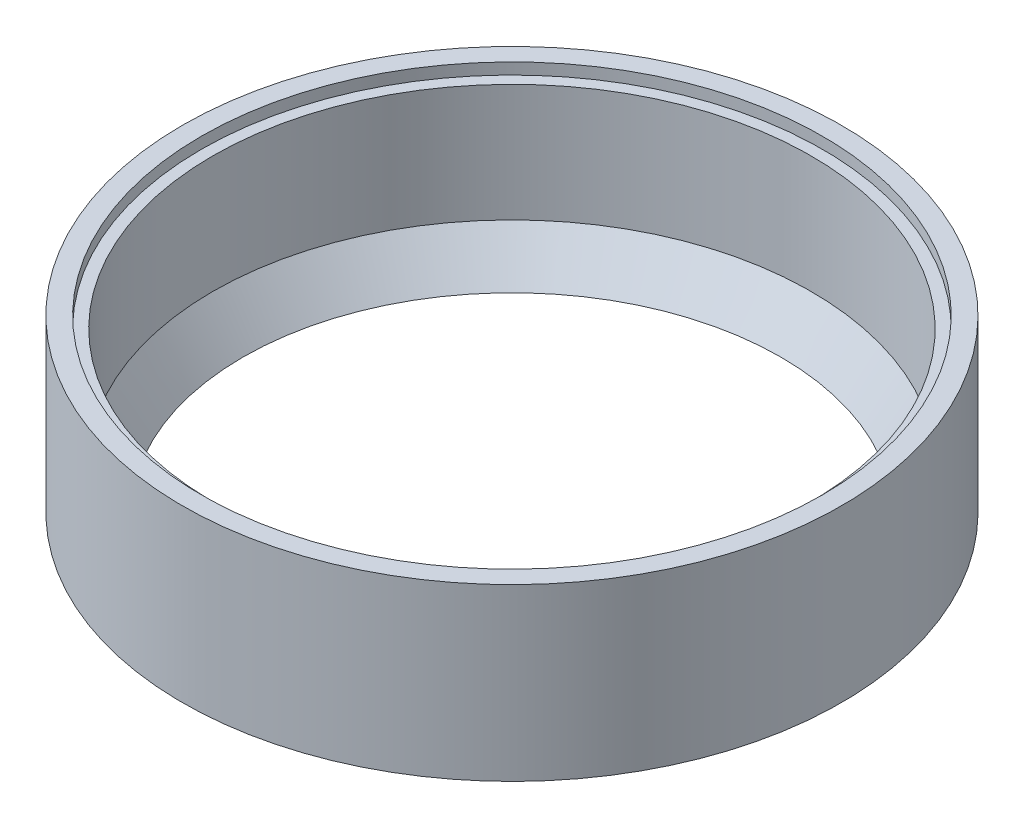
ISO-10303-21;
HEADER;
FILE_DESCRIPTION(('STEP AP214'),'2;1');
FILE_NAME('part.step','',(''),(''),'','','');
FILE_SCHEMA(('AUTOMOTIVE_DESIGN { 1 0 10303 214 1 1 1 1 }'));
ENDSEC;
DATA;
#1=APPLICATION_CONTEXT('core data for automotive mechanical design processes');
#2=APPLICATION_PROTOCOL_DEFINITION('international standard','automotive_design',2000,#1);
#3=PRODUCT_CONTEXT('',#1,'mechanical');
#4=PRODUCT('Part','Part','',(#3));
#5=PRODUCT_RELATED_PRODUCT_CATEGORY('part','',(#4));
#6=PRODUCT_DEFINITION_FORMATION('','',#4);
#7=PRODUCT_DEFINITION_CONTEXT('part definition',#1,'design');
#8=PRODUCT_DEFINITION('design','',#6,#7);
#9=PRODUCT_DEFINITION_SHAPE('','',#8);
#10=(LENGTH_UNIT() NAMED_UNIT(*) SI_UNIT(.MILLI.,.METRE.));
#11=(NAMED_UNIT(*) PLANE_ANGLE_UNIT() SI_UNIT($,.RADIAN.));
#12=(NAMED_UNIT(*) SI_UNIT($,.STERADIAN.) SOLID_ANGLE_UNIT());
#13=UNCERTAINTY_MEASURE_WITH_UNIT(LENGTH_MEASURE(1.E-05),#10,'distance_accuracy_value','');
#14=(GEOMETRIC_REPRESENTATION_CONTEXT(3) GLOBAL_UNCERTAINTY_ASSIGNED_CONTEXT((#13)) GLOBAL_UNIT_ASSIGNED_CONTEXT((#10,
#11,#12)) REPRESENTATION_CONTEXT('',''));
#15=CARTESIAN_POINT('',(0.,0.,0.));
#16=DIRECTION('',(0.,0.,1.));
#17=DIRECTION('',(1.,0.,0.));
#18=AXIS2_PLACEMENT_3D('',#15,#16,#17);
#19=CARTESIAN_POINT('',(0.,13.8123062312929,0.));
#20=DIRECTION('',(0.,1.,0.));
#21=DIRECTION('',(-1.,0.,0.));
#22=AXIS2_PLACEMENT_3D('',#19,#20,#21);
#23=CONICAL_SURFACE('',#22,79.,0.628796286415434);
#24=CARTESIAN_POINT('',(0.,2.81230623129294,0.));
#25=DIRECTION('',(0.,1.,0.));
#26=DIRECTION('',(-1.,0.,0.));
#27=AXIS2_PLACEMENT_3D('',#24,#25,#26);
#28=CIRCLE('',#27,71.);
#29=CARTESIAN_POINT('',(-71.,2.81230623129293,0.));
#30=VERTEX_POINT('',#29);
#31=EDGE_CURVE('E10',#30,#30,#28,.T.);
#32=ORIENTED_EDGE('',*,*,#31,.F.);
#33=EDGE_LOOP('',(#32));
#34=FACE_BOUND('',#33,.T.);
#35=CARTESIAN_POINT('',(0.,13.8123062312929,0.));
#36=DIRECTION('',(0.,1.,0.));
#37=DIRECTION('',(-1.,0.,0.));
#38=AXIS2_PLACEMENT_3D('',#35,#36,#37);
#39=CIRCLE('',#38,79.);
#40=CARTESIAN_POINT('',(-79.,13.8123062312929,0.));
#41=VERTEX_POINT('',#40);
#42=EDGE_CURVE('E68',#41,#41,#39,.T.);
#43=ORIENTED_EDGE('',*,*,#42,.T.);
#44=EDGE_LOOP('',(#43));
#45=FACE_BOUND('',#44,.T.);
#46=ADVANCED_FACE('F31',(#34,#45),#23,.F.);
#47=CARTESIAN_POINT('',(71.,2.81230623129295,0.));
#48=DIRECTION('',(0.,1.,0.));
#49=DIRECTION('',(-1.,0.,0.));
#50=AXIS2_PLACEMENT_3D('',#47,#48,#49);
#51=PLANE('',#50);
#52=CARTESIAN_POINT('',(0.,2.81230623129294,0.));
#53=DIRECTION('',(0.,1.,0.));
#54=DIRECTION('',(-1.,0.,0.));
#55=AXIS2_PLACEMENT_3D('',#52,#53,#54);
#56=CIRCLE('',#55,75.);
#57=CARTESIAN_POINT('',(-75.,2.81230623129293,0.));
#58=VERTEX_POINT('',#57);
#59=EDGE_CURVE('E37',#58,#58,#56,.T.);
#60=ORIENTED_EDGE('',*,*,#59,.F.);
#61=EDGE_LOOP('',(#60));
#62=FACE_BOUND('',#61,.T.);
#63=ORIENTED_EDGE('',*,*,#31,.T.);
#64=EDGE_LOOP('',(#63));
#65=FACE_BOUND('',#64,.T.);
#66=ADVANCED_FACE('F123',(#62,#65),#51,.F.);
#67=CARTESIAN_POINT('',(0.,40.546875,0.));
#68=DIRECTION('',(0.,1.,0.));
#69=DIRECTION('',(-1.,0.,0.));
#70=AXIS2_PLACEMENT_3D('',#67,#68,#69);
#71=CYLINDRICAL_SURFACE('',#70,75.);
#72=CARTESIAN_POINT('',(0.,7.81230623129294,0.));
#73=DIRECTION('',(0.,1.,0.));
#74=DIRECTION('',(-1.,0.,0.));
#75=AXIS2_PLACEMENT_3D('',#72,#73,#74);
#76=CIRCLE('',#75,75.);
#77=CARTESIAN_POINT('',(-75.,7.81230623129293,0.));
#78=VERTEX_POINT('',#77);
#79=EDGE_CURVE('E41',#78,#78,#76,.T.);
#80=ORIENTED_EDGE('',*,*,#79,.F.);
#81=EDGE_LOOP('',(#80));
#82=FACE_BOUND('',#81,.T.);
#83=ORIENTED_EDGE('',*,*,#59,.T.);
#84=EDGE_LOOP('',(#83));
#85=FACE_BOUND('',#84,.T.);
#86=ADVANCED_FACE('F118',(#82,#85),#71,.T.);
#87=CARTESIAN_POINT('',(75.,7.81230623129295,0.));
#88=DIRECTION('',(0.,1.,0.));
#89=DIRECTION('',(-1.,0.,0.));
#90=AXIS2_PLACEMENT_3D('',#87,#88,#89);
#91=PLANE('',#90);
#92=CARTESIAN_POINT('',(0.,7.81230623129294,0.));
#93=DIRECTION('',(0.,1.,0.));
#94=DIRECTION('',(-1.,0.,0.));
#95=AXIS2_PLACEMENT_3D('',#92,#93,#94);
#96=CIRCLE('',#95,80.);
#97=CARTESIAN_POINT('',(-80.,7.81230623129293,0.));
#98=VERTEX_POINT('',#97);
#99=EDGE_CURVE('E45',#98,#98,#96,.T.);
#100=ORIENTED_EDGE('',*,*,#99,.F.);
#101=EDGE_LOOP('',(#100));
#102=FACE_BOUND('',#101,.T.);
#103=ORIENTED_EDGE('',*,*,#79,.T.);
#104=EDGE_LOOP('',(#103));
#105=FACE_BOUND('',#104,.T.);
#106=ADVANCED_FACE('F112',(#102,#105),#91,.F.);
#107=CARTESIAN_POINT('',(0.,40.546875,0.));
#108=DIRECTION('',(0.,1.,0.));
#109=DIRECTION('',(-1.,0.,0.));
#110=AXIS2_PLACEMENT_3D('',#107,#108,#109);
#111=CYLINDRICAL_SURFACE('',#110,80.);
#112=CARTESIAN_POINT('',(0.,2.81230623129294,0.));
#113=DIRECTION('',(0.,1.,0.));
#114=DIRECTION('',(-1.,0.,0.));
#115=AXIS2_PLACEMENT_3D('',#112,#113,#114);
#116=CIRCLE('',#115,80.);
#117=CARTESIAN_POINT('',(-80.,2.81230623129293,0.));
#118=VERTEX_POINT('',#117);
#119=EDGE_CURVE('E50',#118,#118,#116,.T.);
#120=ORIENTED_EDGE('',*,*,#119,.F.);
#121=EDGE_LOOP('',(#120));
#122=FACE_BOUND('',#121,.T.);
#123=ORIENTED_EDGE('',*,*,#99,.T.);
#124=EDGE_LOOP('',(#123));
#125=FACE_BOUND('',#124,.T.);
#126=ADVANCED_FACE('F106',(#122,#125),#111,.F.);
#127=CARTESIAN_POINT('',(80.,2.81230623129295,0.));
#128=DIRECTION('',(0.,1.,0.));
#129=DIRECTION('',(-1.,0.,0.));
#130=AXIS2_PLACEMENT_3D('',#127,#128,#129);
#131=PLANE('',#130);
#132=CARTESIAN_POINT('',(0.,2.81230623129294,0.));
#133=DIRECTION('',(0.,1.,0.));
#134=DIRECTION('',(-1.,0.,0.));
#135=AXIS2_PLACEMENT_3D('',#132,#133,#134);
#136=CIRCLE('',#135,87.);
#137=CARTESIAN_POINT('',(-87.,2.81230623129293,0.));
#138=VERTEX_POINT('',#137);
#139=EDGE_CURVE('E53',#138,#138,#136,.T.);
#140=ORIENTED_EDGE('',*,*,#139,.F.);
#141=EDGE_LOOP('',(#140));
#142=FACE_BOUND('',#141,.T.);
#143=ORIENTED_EDGE('',*,*,#119,.T.);
#144=EDGE_LOOP('',(#143));
#145=FACE_BOUND('',#144,.T.);
#146=ADVANCED_FACE('F100',(#142,#145),#131,.F.);
#147=CARTESIAN_POINT('',(0.,40.546875,0.));
#148=DIRECTION('',(0.,1.,0.));
#149=DIRECTION('',(-1.,0.,0.));
#150=AXIS2_PLACEMENT_3D('',#147,#148,#149);
#151=CYLINDRICAL_SURFACE('',#150,87.);
#152=CARTESIAN_POINT('',(0.,47.8123062312929,0.));
#153=DIRECTION('',(0.,1.,0.));
#154=DIRECTION('',(-1.,0.,0.));
#155=AXIS2_PLACEMENT_3D('',#152,#153,#154);
#156=CIRCLE('',#155,87.);
#157=CARTESIAN_POINT('',(-87.,47.8123062312929,0.));
#158=VERTEX_POINT('',#157);
#159=EDGE_CURVE('E56',#158,#158,#156,.T.);
#160=ORIENTED_EDGE('',*,*,#159,.F.);
#161=EDGE_LOOP('',(#160));
#162=FACE_BOUND('',#161,.T.);
#163=ORIENTED_EDGE('',*,*,#139,.T.);
#164=EDGE_LOOP('',(#163));
#165=FACE_BOUND('',#164,.T.);
#166=ADVANCED_FACE('F94',(#162,#165),#151,.T.);
#167=CARTESIAN_POINT('',(87.,47.812306231293,0.));
#168=DIRECTION('',(0.,-1.,0.));
#169=DIRECTION('',(1.,0.,0.));
#170=AXIS2_PLACEMENT_3D('',#167,#168,#169);
#171=PLANE('',#170);
#172=CARTESIAN_POINT('',(0.,47.8123062312929,0.));
#173=DIRECTION('',(0.,1.,0.));
#174=DIRECTION('',(-1.,0.,0.));
#175=AXIS2_PLACEMENT_3D('',#172,#173,#174);
#176=CIRCLE('',#175,82.);
#177=CARTESIAN_POINT('',(-82.,47.8123062312929,0.));
#178=VERTEX_POINT('',#177);
#179=EDGE_CURVE('E59',#178,#178,#176,.T.);
#180=ORIENTED_EDGE('',*,*,#179,.F.);
#181=EDGE_LOOP('',(#180));
#182=FACE_BOUND('',#181,.T.);
#183=ORIENTED_EDGE('',*,*,#159,.T.);
#184=EDGE_LOOP('',(#183));
#185=FACE_BOUND('',#184,.T.);
#186=ADVANCED_FACE('F88',(#182,#185),#171,.F.);
#187=CARTESIAN_POINT('',(0.,40.546875,0.));
#188=DIRECTION('',(0.,1.,0.));
#189=DIRECTION('',(-1.,0.,0.));
#190=AXIS2_PLACEMENT_3D('',#187,#188,#189);
#191=CYLINDRICAL_SURFACE('',#190,82.);
#192=CARTESIAN_POINT('',(0.,44.8123062312929,0.));
#193=DIRECTION('',(0.,1.,0.));
#194=DIRECTION('',(-1.,0.,0.));
#195=AXIS2_PLACEMENT_3D('',#192,#193,#194);
#196=CIRCLE('',#195,82.);
#197=CARTESIAN_POINT('',(-82.,44.8123062312929,0.));
#198=VERTEX_POINT('',#197);
#199=EDGE_CURVE('E62',#198,#198,#196,.T.);
#200=ORIENTED_EDGE('',*,*,#199,.F.);
#201=EDGE_LOOP('',(#200));
#202=FACE_BOUND('',#201,.T.);
#203=ORIENTED_EDGE('',*,*,#179,.T.);
#204=EDGE_LOOP('',(#203));
#205=FACE_BOUND('',#204,.T.);
#206=ADVANCED_FACE('F82',(#202,#205),#191,.F.);
#207=CARTESIAN_POINT('',(82.,44.8123062312929,0.));
#208=DIRECTION('',(0.,-1.,0.));
#209=DIRECTION('',(1.,0.,0.));
#210=AXIS2_PLACEMENT_3D('',#207,#208,#209);
#211=PLANE('',#210);
#212=CARTESIAN_POINT('',(0.,44.8123062312929,0.));
#213=DIRECTION('',(0.,1.,0.));
#214=DIRECTION('',(-1.,0.,0.));
#215=AXIS2_PLACEMENT_3D('',#212,#213,#214);
#216=CIRCLE('',#215,79.);
#217=CARTESIAN_POINT('',(-79.,44.8123062312929,0.));
#218=VERTEX_POINT('',#217);
#219=EDGE_CURVE('E65',#218,#218,#216,.T.);
#220=ORIENTED_EDGE('',*,*,#219,.F.);
#221=EDGE_LOOP('',(#220));
#222=FACE_BOUND('',#221,.T.);
#223=ORIENTED_EDGE('',*,*,#199,.T.);
#224=EDGE_LOOP('',(#223));
#225=FACE_BOUND('',#224,.T.);
#226=ADVANCED_FACE('F76',(#222,#225),#211,.F.);
#227=CARTESIAN_POINT('',(0.,40.546875,0.));
#228=DIRECTION('',(0.,1.,0.));
#229=DIRECTION('',(-1.,0.,0.));
#230=AXIS2_PLACEMENT_3D('',#227,#228,#229);
#231=CYLINDRICAL_SURFACE('',#230,79.);
#232=ORIENTED_EDGE('',*,*,#42,.F.);
#233=EDGE_LOOP('',(#232));
#234=FACE_BOUND('',#233,.T.);
#235=ORIENTED_EDGE('',*,*,#219,.T.);
#236=EDGE_LOOP('',(#235));
#237=FACE_BOUND('',#236,.T.);
#238=ADVANCED_FACE('F73',(#234,#237),#231,.F.);
#239=CLOSED_SHELL('',(#46,#66,#86,#106,#126,#146,#166,#186,#206,#226,#238));
#240=MANIFOLD_SOLID_BREP('B2',#239);
#241=ADVANCED_BREP_SHAPE_REPRESENTATION('',(#18,#240),#14);
#242=SHAPE_DEFINITION_REPRESENTATION(#9,#241);
ENDSEC;
END-ISO-10303-21;
